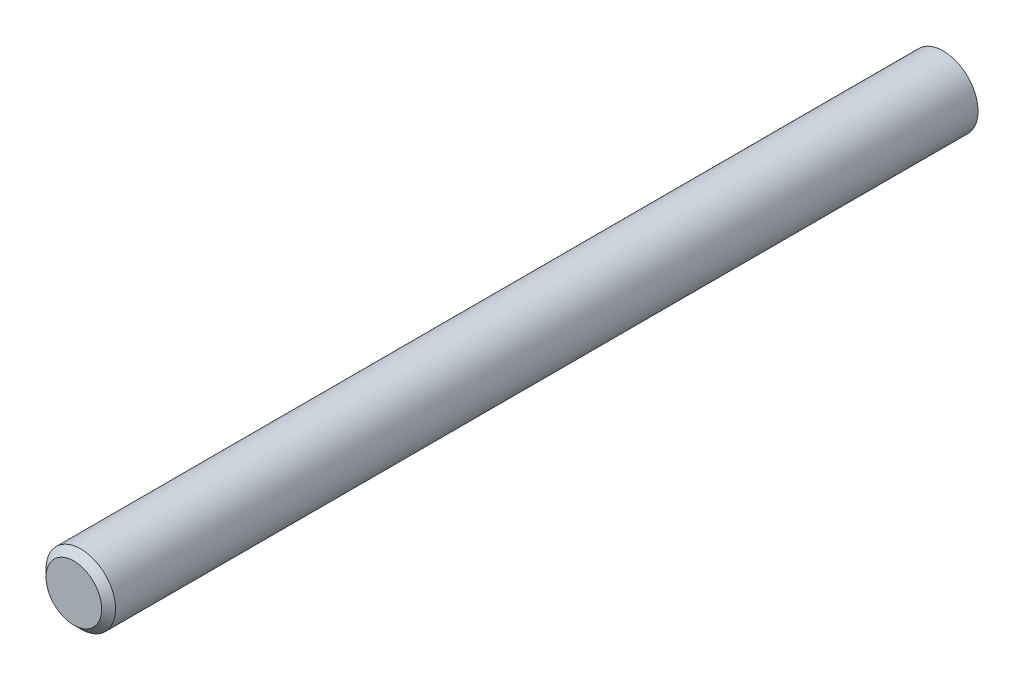
ISO-10303-21;
HEADER;
FILE_DESCRIPTION(('STEP AP214'),'2;1');
FILE_NAME('part.step','',(''),(''),'','','');
FILE_SCHEMA(('AUTOMOTIVE_DESIGN { 1 0 10303 214 1 1 1 1 }'));
ENDSEC;
DATA;
#1=APPLICATION_CONTEXT('core data for automotive mechanical design processes');
#2=APPLICATION_PROTOCOL_DEFINITION('international standard','automotive_design',2000,#1);
#3=PRODUCT_CONTEXT('',#1,'mechanical');
#4=PRODUCT('Part','Part','',(#3));
#5=PRODUCT_RELATED_PRODUCT_CATEGORY('part','',(#4));
#6=PRODUCT_DEFINITION_FORMATION('','',#4);
#7=PRODUCT_DEFINITION_CONTEXT('part definition',#1,'design');
#8=PRODUCT_DEFINITION('design','',#6,#7);
#9=PRODUCT_DEFINITION_SHAPE('','',#8);
#10=(LENGTH_UNIT() NAMED_UNIT(*) SI_UNIT(.MILLI.,.METRE.));
#11=(NAMED_UNIT(*) PLANE_ANGLE_UNIT() SI_UNIT($,.RADIAN.));
#12=(NAMED_UNIT(*) SI_UNIT($,.STERADIAN.) SOLID_ANGLE_UNIT());
#13=UNCERTAINTY_MEASURE_WITH_UNIT(LENGTH_MEASURE(1.E-05),#10,'distance_accuracy_value','');
#14=(GEOMETRIC_REPRESENTATION_CONTEXT(3) GLOBAL_UNCERTAINTY_ASSIGNED_CONTEXT((#13)) GLOBAL_UNIT_ASSIGNED_CONTEXT((#10,
#11,#12)) REPRESENTATION_CONTEXT('',''));
#15=CARTESIAN_POINT('',(0.,0.,0.));
#16=DIRECTION('',(0.,0.,1.));
#17=DIRECTION('',(1.,0.,0.));
#18=AXIS2_PLACEMENT_3D('',#15,#16,#17);
#19=CARTESIAN_POINT('',(0.,0.,300.));
#20=DIRECTION('',(0.,0.,-1.));
#21=DIRECTION('',(-1.,0.,0.));
#22=AXIS2_PLACEMENT_3D('',#19,#20,#21);
#23=CYLINDRICAL_SURFACE('',#22,4.);
#24=CARTESIAN_POINT('',(0.,0.,299.2));
#25=DIRECTION('',(0.,0.,1.));
#26=DIRECTION('',(1.,0.,0.));
#27=AXIS2_PLACEMENT_3D('',#24,#25,#26);
#28=CIRCLE('',#27,4.);
#29=CARTESIAN_POINT('',(-4.00000000000003,0.,299.2));
#30=VERTEX_POINT('',#29);
#31=EDGE_CURVE('E46',#30,#30,#28,.F.);
#32=ORIENTED_EDGE('',*,*,#31,.T.);
#33=EDGE_LOOP('',(#32));
#34=FACE_BOUND('',#33,.T.);
#35=CARTESIAN_POINT('',(0.,0.,200.));
#36=DIRECTION('',(0.,0.,-1.));
#37=DIRECTION('',(-1.,0.,0.));
#38=AXIS2_PLACEMENT_3D('',#35,#36,#37);
#39=CIRCLE('',#38,4.);
#40=CARTESIAN_POINT('',(-4.,0.,200.));
#41=VERTEX_POINT('',#40);
#42=EDGE_CURVE('E41',#41,#41,#39,.T.);
#43=ORIENTED_EDGE('',*,*,#42,.F.);
#44=EDGE_LOOP('',(#43));
#45=FACE_BOUND('',#44,.T.);
#46=ADVANCED_FACE('F37',(#34,#45),#23,.T.);
#47=CARTESIAN_POINT('',(0.,0.,300.));
#48=DIRECTION('',(0.,0.,1.));
#49=DIRECTION('',(1.,0.,0.));
#50=AXIS2_PLACEMENT_3D('',#47,#48,#49);
#51=PLANE('',#50);
#52=CARTESIAN_POINT('',(0.,0.,300.));
#53=DIRECTION('',(0.,0.,1.));
#54=DIRECTION('',(1.,0.,0.));
#55=AXIS2_PLACEMENT_3D('',#52,#53,#54);
#56=CIRCLE('',#55,3.20000000000009);
#57=CARTESIAN_POINT('',(-3.20000000000012,0.,300.));
#58=VERTEX_POINT('',#57);
#59=EDGE_CURVE('E10',#58,#58,#56,.T.);
#60=ORIENTED_EDGE('',*,*,#59,.T.);
#61=EDGE_LOOP('',(#60));
#62=FACE_BOUND('',#61,.T.);
#63=ADVANCED_FACE('F61',(#62),#51,.T.);
#64=CARTESIAN_POINT('',(0.,0.,300.));
#65=DIRECTION('',(0.,0.,-1.));
#66=DIRECTION('',(-1.,0.,0.));
#67=AXIS2_PLACEMENT_3D('',#64,#65,#66);
#68=CONICAL_SURFACE('',#67,3.20000000000009,0.785398163397446);
#69=CARTESIAN_POINT('',(-4.00000000000003,0.,299.2));
#70=CARTESIAN_POINT('',(-3.9916666666667,0.,299.208333333333));
#71=CARTESIAN_POINT('',(-3.98333333333336,0.,299.216666666667));
#72=CARTESIAN_POINT('',(-3.9666666666667,0.,299.233333333333));
#73=CARTESIAN_POINT('',(-3.95833333333337,0.,299.241666666667));
#74=CARTESIAN_POINT('',(-3.9416666666667,0.,299.258333333333));
#75=CARTESIAN_POINT('',(-3.93333333333337,0.,299.266666666667));
#76=CARTESIAN_POINT('',(-3.9166666666667,0.,299.283333333333));
#77=CARTESIAN_POINT('',(-3.90833333333337,0.,299.291666666667));
#78=CARTESIAN_POINT('',(-3.89166666666671,0.,299.308333333333));
#79=CARTESIAN_POINT('',(-3.88333333333338,0.,299.316666666667));
#80=CARTESIAN_POINT('',(-3.86666666666671,0.,299.333333333333));
#81=CARTESIAN_POINT('',(-3.85833333333338,0.,299.341666666667));
#82=CARTESIAN_POINT('',(-3.84166666666671,0.,299.358333333333));
#83=CARTESIAN_POINT('',(-3.83333333333338,0.,299.366666666667));
#84=CARTESIAN_POINT('',(-3.81666666666672,0.,299.383333333333));
#85=CARTESIAN_POINT('',(-3.80833333333338,0.,299.391666666667));
#86=CARTESIAN_POINT('',(-3.79166666666672,0.,299.408333333333));
#87=CARTESIAN_POINT('',(-3.78333333333339,0.,299.416666666667));
#88=CARTESIAN_POINT('',(-3.76666666666672,0.,299.433333333333));
#89=CARTESIAN_POINT('',(-3.75833333333339,0.,299.441666666667));
#90=CARTESIAN_POINT('',(-3.74166666666672,0.,299.458333333333));
#91=CARTESIAN_POINT('',(-3.73333333333339,0.,299.466666666667));
#92=CARTESIAN_POINT('',(-3.71666666666673,0.,299.483333333333));
#93=CARTESIAN_POINT('',(-3.70833333333339,0.,299.491666666667));
#94=CARTESIAN_POINT('',(-3.69166666666673,0.,299.508333333333));
#95=CARTESIAN_POINT('',(-3.6833333333334,0.,299.516666666667));
#96=CARTESIAN_POINT('',(-3.66666666666673,0.,299.533333333333));
#97=CARTESIAN_POINT('',(-3.6583333333334,0.,299.541666666667));
#98=CARTESIAN_POINT('',(-3.64166666666674,0.,299.558333333333));
#99=CARTESIAN_POINT('',(-3.6333333333334,0.,299.566666666667));
#100=CARTESIAN_POINT('',(-3.61666666666674,0.,299.583333333333));
#101=CARTESIAN_POINT('',(-3.60833333333341,0.,299.591666666667));
#102=CARTESIAN_POINT('',(-3.59166666666674,0.,299.608333333333));
#103=CARTESIAN_POINT('',(-3.58333333333341,0.,299.616666666667));
#104=CARTESIAN_POINT('',(-3.56666666666674,0.,299.633333333333));
#105=CARTESIAN_POINT('',(-3.55833333333341,0.,299.641666666667));
#106=CARTESIAN_POINT('',(-3.54166666666675,0.,299.658333333333));
#107=CARTESIAN_POINT('',(-3.53333333333341,0.,299.666666666667));
#108=CARTESIAN_POINT('',(-3.51666666666675,0.,299.683333333333));
#109=CARTESIAN_POINT('',(-3.50833333333342,0.,299.691666666667));
#110=CARTESIAN_POINT('',(-3.49166666666675,0.,299.708333333333));
#111=CARTESIAN_POINT('',(-3.48333333333342,0.,299.716666666667));
#112=CARTESIAN_POINT('',(-3.46666666666676,0.,299.733333333333));
#113=CARTESIAN_POINT('',(-3.45833333333342,0.,299.741666666667));
#114=CARTESIAN_POINT('',(-3.44166666666676,0.,299.758333333333));
#115=CARTESIAN_POINT('',(-3.43333333333343,0.,299.766666666667));
#116=CARTESIAN_POINT('',(-3.41666666666676,0.,299.783333333333));
#117=CARTESIAN_POINT('',(-3.40833333333343,0.,299.791666666667));
#118=CARTESIAN_POINT('',(-3.39166666666676,0.,299.808333333333));
#119=CARTESIAN_POINT('',(-3.38333333333343,0.,299.816666666667));
#120=CARTESIAN_POINT('',(-3.36666666666677,0.,299.833333333333));
#121=CARTESIAN_POINT('',(-3.35833333333344,0.,299.841666666667));
#122=CARTESIAN_POINT('',(-3.34166666666677,0.,299.858333333333));
#123=CARTESIAN_POINT('',(-3.33333333333344,0.,299.866666666667));
#124=CARTESIAN_POINT('',(-3.31666666666677,0.,299.883333333333));
#125=CARTESIAN_POINT('',(-3.30833333333344,0.,299.891666666667));
#126=CARTESIAN_POINT('',(-3.29166666666678,0.,299.908333333333));
#127=CARTESIAN_POINT('',(-3.28333333333344,0.,299.916666666667));
#128=CARTESIAN_POINT('',(-3.26666666666678,0.,299.933333333333));
#129=CARTESIAN_POINT('',(-3.25833333333345,0.,299.941666666667));
#130=CARTESIAN_POINT('',(-3.24166666666678,0.,299.958333333333));
#131=CARTESIAN_POINT('',(-3.23333333333345,0.,299.966666666667));
#132=CARTESIAN_POINT('',(-3.21666666666678,0.,299.983333333333));
#133=CARTESIAN_POINT('',(-3.20833333333345,0.,299.991666666667));
#134=CARTESIAN_POINT('',(-3.20000000000012,0.,300.));
#135=B_SPLINE_CURVE_WITH_KNOTS('',3,(#69,#70,#71,#72,#73,#74,#75,#76,#77,#78,#79,#80,#81,#82,
#83,#84,#85,#86,#87,#88,#89,#90,#91,#92,#93,#94,#95,#96,#97,#98,#99,#100,#101,#102,#103,#104,
#105,#106,#107,#108,#109,#110,#111,#112,#113,#114,#115,#116,#117,#118,#119,#120,#121,#122,#123,
#124,#125,#126,#127,#128,#129,#130,#131,#132,#133,#134),.UNSPECIFIED.,.F.,.F.,(4,2,2,2,2,2,2,2,
2,2,2,2,2,2,2,2,2,2,2,2,2,2,2,2,2,2,2,2,2,2,2,2,4),(0.,0.0353553390593235,0.070710678118647,
0.10606601717797,0.141421356237294,0.176776695296617,0.21213203435594,0.247487373415264,
0.282842712474587,0.318198051533911,0.353553390593234,0.388908729652557,0.424264068711881,
0.459619407771204,0.494974746830527,0.530330085889851,0.565685424949175,0.601040764008498,
0.636396103067821,0.671751442127145,0.707106781186468,0.742462120245792,0.777817459305115,
0.813172798364438,0.848528137423762,0.883883476483086,0.919238815542409,0.954594154601732,
0.989949493661056,1.02530483272038,1.0606601717797,1.09601551083903,1.13137084989835),.UNSPECIFIED.);
#136=EDGE_CURVE('BSEAM39',#30,#58,#135,.T.);
#137=ORIENTED_EDGE('',*,*,#31,.F.);
#138=ORIENTED_EDGE('',*,*,#59,.F.);
#139=ORIENTED_EDGE('',*,*,#136,.T.);
#140=ORIENTED_EDGE('',*,*,#136,.F.);
#141=EDGE_LOOP('',(#137,#139,#138,#140));
#142=FACE_BOUND('',#141,.T.);
#143=ADVANCED_FACE('F39',(#142),#68,.T.);
#144=CARTESIAN_POINT('',(0.,0.,200.));
#145=DIRECTION('',(0.,0.,-1.));
#146=DIRECTION('',(-1.,0.,0.));
#147=AXIS2_PLACEMENT_3D('',#144,#145,#146);
#148=PLANE('',#147);
#149=ORIENTED_EDGE('',*,*,#42,.T.);
#150=EDGE_LOOP('',(#149));
#151=FACE_BOUND('',#150,.T.);
#152=ADVANCED_FACE('F58',(#151),#148,.T.);
#153=CLOSED_SHELL('',(#46,#63,#143,#152));
#154=MANIFOLD_SOLID_BREP('B2',#153);
#155=ADVANCED_BREP_SHAPE_REPRESENTATION('',(#18,#154),#14);
#156=SHAPE_DEFINITION_REPRESENTATION(#9,#155);
ENDSEC;
END-ISO-10303-21;
